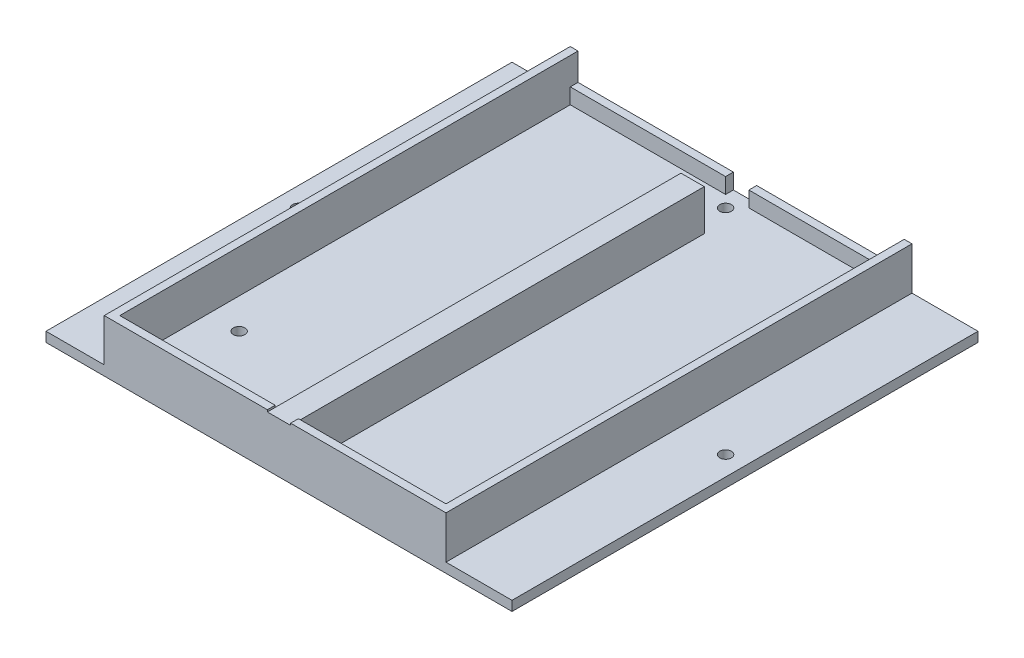
ISO-10303-21;
HEADER;
FILE_DESCRIPTION(('STEP AP214'),'2;1');
FILE_NAME('part.step','',(''),(''),'','','');
FILE_SCHEMA(('AUTOMOTIVE_DESIGN { 1 0 10303 214 1 1 1 1 }'));
ENDSEC;
DATA;
#1=APPLICATION_CONTEXT('core data for automotive mechanical design processes');
#2=APPLICATION_PROTOCOL_DEFINITION('international standard','automotive_design',2000,#1);
#3=PRODUCT_CONTEXT('',#1,'mechanical');
#4=PRODUCT('Part','Part','',(#3));
#5=PRODUCT_RELATED_PRODUCT_CATEGORY('part','',(#4));
#6=PRODUCT_DEFINITION_FORMATION('','',#4);
#7=PRODUCT_DEFINITION_CONTEXT('part definition',#1,'design');
#8=PRODUCT_DEFINITION('design','',#6,#7);
#9=PRODUCT_DEFINITION_SHAPE('','',#8);
#10=(LENGTH_UNIT() NAMED_UNIT(*) SI_UNIT(.MILLI.,.METRE.));
#11=(NAMED_UNIT(*) PLANE_ANGLE_UNIT() SI_UNIT($,.RADIAN.));
#12=(NAMED_UNIT(*) SI_UNIT($,.STERADIAN.) SOLID_ANGLE_UNIT());
#13=UNCERTAINTY_MEASURE_WITH_UNIT(LENGTH_MEASURE(1.E-05),#10,'distance_accuracy_value','');
#14=(GEOMETRIC_REPRESENTATION_CONTEXT(3) GLOBAL_UNCERTAINTY_ASSIGNED_CONTEXT((#13)) GLOBAL_UNIT_ASSIGNED_CONTEXT((#10,
#11,#12)) REPRESENTATION_CONTEXT('',''));
#15=CARTESIAN_POINT('',(0.,0.,0.));
#16=DIRECTION('',(0.,0.,1.));
#17=DIRECTION('',(1.,0.,0.));
#18=AXIS2_PLACEMENT_3D('',#15,#16,#17);
#19=CARTESIAN_POINT('',(2.99999999999999,13.,0.));
#20=DIRECTION('',(1.,0.,0.));
#21=DIRECTION('',(0.,0.,-1.));
#22=AXIS2_PLACEMENT_3D('',#19,#20,#21);
#23=PLANE('',#22);
#24=DIRECTION('',(0.,0.,1.));
#25=VECTOR('',#24,1.);
#26=CARTESIAN_POINT('',(2.99999999999999,2.5,0.));
#27=LINE('',#26,#25);
#28=CARTESIAN_POINT('',(3.00000000000001,2.5,-46.5076114932204));
#29=VERTEX_POINT('',#28);
#30=CARTESIAN_POINT('',(2.99999999999999,2.5,58.));
#31=VERTEX_POINT('',#30);
#32=EDGE_CURVE('E222',#29,#31,#27,.T.);
#33=ORIENTED_EDGE('',*,*,#32,.F.);
#34=DIRECTION('',(0.,-1.,0.));
#35=VECTOR('',#34,1.);
#36=CARTESIAN_POINT('',(3.00000000000001,13.5,-46.5076114932204));
#37=LINE('',#36,#35);
#38=CARTESIAN_POINT('',(3.00000000000001,13.,-46.5076114932204));
#39=VERTEX_POINT('',#38);
#40=EDGE_CURVE('E208',#39,#29,#37,.T.);
#41=ORIENTED_EDGE('',*,*,#40,.F.);
#42=DIRECTION('',(0.,0.,1.));
#43=VECTOR('',#42,1.);
#44=CARTESIAN_POINT('',(2.99999999999999,13.,0.));
#45=LINE('',#44,#43);
#46=CARTESIAN_POINT('',(2.99999999999999,13.,58.));
#47=VERTEX_POINT('',#46);
#48=EDGE_CURVE('E419',#39,#47,#45,.T.);
#49=ORIENTED_EDGE('',*,*,#48,.T.);
#50=DIRECTION('',(0.,-1.,0.));
#51=VECTOR('',#50,1.);
#52=CARTESIAN_POINT('',(2.99999999999999,13.5,58.));
#53=LINE('',#52,#51);
#54=EDGE_CURVE('E229',#47,#31,#53,.T.);
#55=ORIENTED_EDGE('',*,*,#54,.T.);
#56=EDGE_LOOP('',(#33,#41,#49,#55));
#57=FACE_BOUND('',#56,.T.);
#58=ADVANCED_FACE('F38',(#57),#23,.T.);
#59=CARTESIAN_POINT('',(-3.,13.,0.));
#60=DIRECTION('',(-1.,0.,0.));
#61=DIRECTION('',(0.,0.,1.));
#62=AXIS2_PLACEMENT_3D('',#59,#60,#61);
#63=PLANE('',#62);
#64=DIRECTION('',(0.,0.,-1.));
#65=VECTOR('',#64,1.);
#66=CARTESIAN_POINT('',(-3.,13.,0.));
#67=LINE('',#66,#65);
#68=CARTESIAN_POINT('',(-3.00000000000001,13.,58.));
#69=VERTEX_POINT('',#68);
#70=CARTESIAN_POINT('',(-3.,13.,-46.5076114932204));
#71=VERTEX_POINT('',#70);
#72=EDGE_CURVE('E231',#69,#71,#67,.T.);
#73=ORIENTED_EDGE('',*,*,#72,.T.);
#74=DIRECTION('',(0.,-1.,0.));
#75=VECTOR('',#74,1.);
#76=CARTESIAN_POINT('',(-3.,13.5,-46.5076114932204));
#77=LINE('',#76,#75);
#78=CARTESIAN_POINT('',(-3.,2.5,-46.5076114932204));
#79=VERTEX_POINT('',#78);
#80=EDGE_CURVE('E216',#71,#79,#77,.T.);
#81=ORIENTED_EDGE('',*,*,#80,.T.);
#82=DIRECTION('',(0.,0.,-1.));
#83=VECTOR('',#82,1.);
#84=CARTESIAN_POINT('',(-3.,2.5,0.));
#85=LINE('',#84,#83);
#86=CARTESIAN_POINT('',(-3.00000000000001,2.5,58.));
#87=VERTEX_POINT('',#86);
#88=EDGE_CURVE('E225',#87,#79,#85,.T.);
#89=ORIENTED_EDGE('',*,*,#88,.F.);
#90=DIRECTION('',(0.,-1.,0.));
#91=VECTOR('',#90,1.);
#92=CARTESIAN_POINT('',(-3.00000000000001,13.5,58.));
#93=LINE('',#92,#91);
#94=EDGE_CURVE('E413',#69,#87,#93,.T.);
#95=ORIENTED_EDGE('',*,*,#94,.F.);
#96=EDGE_LOOP('',(#73,#81,#89,#95));
#97=FACE_BOUND('',#96,.T.);
#98=ADVANCED_FACE('F480',(#97),#63,.T.);
#99=CARTESIAN_POINT('',(0.,13.,0.));
#100=DIRECTION('',(0.,1.,0.));
#101=DIRECTION('',(0.,0.,1.));
#102=AXIS2_PLACEMENT_3D('',#99,#100,#101);
#103=PLANE('',#102);
#104=ORIENTED_EDGE('',*,*,#48,.F.);
#105=DIRECTION('',(-1.,0.,0.));
#106=VECTOR('',#105,1.);
#107=CARTESIAN_POINT('',(0.,13.,-46.5076114932204));
#108=LINE('',#107,#106);
#109=EDGE_CURVE('E11',#39,#71,#108,.T.);
#110=ORIENTED_EDGE('',*,*,#109,.T.);
#111=ORIENTED_EDGE('',*,*,#72,.F.);
#112=CARTESIAN_POINT('',(-3.00000000000001,13.,60.));
#113=VERTEX_POINT('',#112);
#114=EDGE_CURVE('E234',#113,#69,#67,.T.);
#115=ORIENTED_EDGE('',*,*,#114,.F.);
#116=DIRECTION('',(1.,0.,0.));
#117=VECTOR('',#116,1.);
#118=CARTESIAN_POINT('',(0.,13.,60.));
#119=LINE('',#118,#117);
#120=CARTESIAN_POINT('',(2.99999999999999,13.,60.));
#121=VERTEX_POINT('',#120);
#122=EDGE_CURVE('E417',#113,#121,#119,.T.);
#123=ORIENTED_EDGE('',*,*,#122,.T.);
#124=EDGE_CURVE('E418',#47,#121,#45,.T.);
#125=ORIENTED_EDGE('',*,*,#124,.F.);
#126=EDGE_LOOP('',(#104,#110,#111,#115,#123,#125));
#127=FACE_BOUND('',#126,.T.);
#128=ADVANCED_FACE('F484',(#127),#103,.T.);
#129=CARTESIAN_POINT('',(0.,0.,-60.));
#130=DIRECTION('',(0.,0.,-1.));
#131=DIRECTION('',(-1.,0.,0.));
#132=AXIS2_PLACEMENT_3D('',#129,#130,#131);
#133=PLANE('',#132);
#134=DIRECTION('',(-1.,0.,0.));
#135=VECTOR('',#134,1.);
#136=CARTESIAN_POINT('',(41.,6.5,-60.));
#137=LINE('',#136,#135);
#138=CARTESIAN_POINT('',(-2.99999999999999,6.5,-60.));
#139=VERTEX_POINT('',#138);
#140=CARTESIAN_POINT('',(-43.,6.5,-60.));
#141=VERTEX_POINT('',#140);
#142=EDGE_CURVE('E55',#139,#141,#137,.T.);
#143=ORIENTED_EDGE('',*,*,#142,.F.);
#144=DIRECTION('',(0.,-1.,0.));
#145=VECTOR('',#144,1.);
#146=CARTESIAN_POINT('',(-3.,30.5,-60.));
#147=LINE('',#146,#145);
#148=CARTESIAN_POINT('',(-3.,2.5,-60.));
#149=VERTEX_POINT('',#148);
#150=EDGE_CURVE('E308',#139,#149,#147,.T.);
#151=ORIENTED_EDGE('',*,*,#150,.T.);
#152=DIRECTION('',(-1.,0.,0.));
#153=VECTOR('',#152,1.);
#154=CARTESIAN_POINT('',(0.,2.5,-60.));
#155=LINE('',#154,#153);
#156=CARTESIAN_POINT('',(3.00000000000002,2.5,-60.));
#157=VERTEX_POINT('',#156);
#158=EDGE_CURVE('E297',#157,#149,#155,.T.);
#159=ORIENTED_EDGE('',*,*,#158,.F.);
#160=DIRECTION('',(0.,-1.,0.));
#161=VECTOR('',#160,1.);
#162=CARTESIAN_POINT('',(3.00000000000002,30.5,-60.));
#163=LINE('',#162,#161);
#164=CARTESIAN_POINT('',(3.00000000000002,6.5,-60.));
#165=VERTEX_POINT('',#164);
#166=EDGE_CURVE('E306',#165,#157,#163,.T.);
#167=ORIENTED_EDGE('',*,*,#166,.F.);
#168=CARTESIAN_POINT('',(41.,6.5,-60.));
#169=VERTEX_POINT('',#168);
#170=EDGE_CURVE('E312',#169,#165,#137,.T.);
#171=ORIENTED_EDGE('',*,*,#170,.F.);
#172=DIRECTION('',(0.,-1.,0.));
#173=VECTOR('',#172,1.);
#174=CARTESIAN_POINT('',(41.,13.5,-60.));
#175=LINE('',#174,#173);
#176=CARTESIAN_POINT('',(41.,13.5,-60.));
#177=VERTEX_POINT('',#176);
#178=EDGE_CURVE('E364',#177,#169,#175,.T.);
#179=ORIENTED_EDGE('',*,*,#178,.F.);
#180=DIRECTION('',(-1.,0.,0.));
#181=VECTOR('',#180,1.);
#182=CARTESIAN_POINT('',(43.,13.5,-60.));
#183=LINE('',#182,#181);
#184=CARTESIAN_POINT('',(43.,13.5,-60.));
#185=VERTEX_POINT('',#184);
#186=EDGE_CURVE('E347',#185,#177,#183,.T.);
#187=ORIENTED_EDGE('',*,*,#186,.F.);
#188=DIRECTION('',(0.,-1.,0.));
#189=VECTOR('',#188,1.);
#190=CARTESIAN_POINT('',(43.,13.5,-60.));
#191=LINE('',#190,#189);
#192=CARTESIAN_POINT('',(43.,2.5,-60.));
#193=VERTEX_POINT('',#192);
#194=EDGE_CURVE('E367',#185,#193,#191,.T.);
#195=ORIENTED_EDGE('',*,*,#194,.T.);
#196=DIRECTION('',(-1.,0.,0.));
#197=VECTOR('',#196,1.);
#198=CARTESIAN_POINT('',(0.,2.5,-60.));
#199=LINE('',#198,#197);
#200=CARTESIAN_POINT('',(60.,2.5,-60.));
#201=VERTEX_POINT('',#200);
#202=EDGE_CURVE('E250',#201,#193,#199,.T.);
#203=ORIENTED_EDGE('',*,*,#202,.F.);
#204=DIRECTION('',(0.,1.,0.));
#205=VECTOR('',#204,1.);
#206=CARTESIAN_POINT('',(60.,0.,-60.));
#207=LINE('',#206,#205);
#208=CARTESIAN_POINT('',(60.,0.,-60.));
#209=VERTEX_POINT('',#208);
#210=EDGE_CURVE('E47',#209,#201,#207,.T.);
#211=ORIENTED_EDGE('',*,*,#210,.F.);
#212=DIRECTION('',(-1.,0.,0.));
#213=VECTOR('',#212,1.);
#214=CARTESIAN_POINT('',(60.,0.,-60.));
#215=LINE('',#214,#213);
#216=CARTESIAN_POINT('',(-60.,0.,-60.));
#217=VERTEX_POINT('',#216);
#218=EDGE_CURVE('E240',#209,#217,#215,.T.);
#219=ORIENTED_EDGE('',*,*,#218,.T.);
#220=DIRECTION('',(0.,1.,0.));
#221=VECTOR('',#220,1.);
#222=CARTESIAN_POINT('',(-60.,0.,-60.));
#223=LINE('',#222,#221);
#224=CARTESIAN_POINT('',(-60.,2.5,-60.));
#225=VERTEX_POINT('',#224);
#226=EDGE_CURVE('E249',#217,#225,#223,.T.);
#227=ORIENTED_EDGE('',*,*,#226,.T.);
#228=CARTESIAN_POINT('',(-45.,2.5,-60.));
#229=VERTEX_POINT('',#228);
#230=EDGE_CURVE('E253',#229,#225,#199,.T.);
#231=ORIENTED_EDGE('',*,*,#230,.F.);
#232=DIRECTION('',(0.,-1.,0.));
#233=VECTOR('',#232,1.);
#234=CARTESIAN_POINT('',(-45.,13.5,-60.));
#235=LINE('',#234,#233);
#236=CARTESIAN_POINT('',(-45.,13.5,-60.));
#237=VERTEX_POINT('',#236);
#238=EDGE_CURVE('E404',#237,#229,#235,.T.);
#239=ORIENTED_EDGE('',*,*,#238,.F.);
#240=DIRECTION('',(-1.,0.,0.));
#241=VECTOR('',#240,1.);
#242=CARTESIAN_POINT('',(0.,13.5,-60.));
#243=LINE('',#242,#241);
#244=CARTESIAN_POINT('',(-43.,13.5,-60.));
#245=VERTEX_POINT('',#244);
#246=EDGE_CURVE('E385',#245,#237,#243,.T.);
#247=ORIENTED_EDGE('',*,*,#246,.F.);
#248=DIRECTION('',(0.,-1.,0.));
#249=VECTOR('',#248,1.);
#250=CARTESIAN_POINT('',(-43.,13.5,-60.));
#251=LINE('',#250,#249);
#252=EDGE_CURVE('E407',#245,#141,#251,.T.);
#253=ORIENTED_EDGE('',*,*,#252,.T.);
#254=EDGE_LOOP('',(#143,#151,#159,#167,#171,#179,#187,#195,#203,#211,#219,#227,#231,#239,#247,#253));
#255=FACE_BOUND('',#254,.T.);
#256=ADVANCED_FACE('F454',(#255),#133,.T.);
#257=CARTESIAN_POINT('',(0.,2.5,0.));
#258=DIRECTION('',(0.,1.,0.));
#259=DIRECTION('',(0.,0.,1.));
#260=AXIS2_PLACEMENT_3D('',#257,#258,#259);
#261=PLANE('',#260);
#262=CARTESIAN_POINT('',(0.,2.5,-55.));
#263=DIRECTION('',(0.,1.,0.));
#264=DIRECTION('',(0.,0.,1.));
#265=AXIS2_PLACEMENT_3D('',#262,#263,#264);
#266=CIRCLE('',#265,1.5);
#267=CARTESIAN_POINT('',(0.,2.5,-53.5));
#268=VERTEX_POINT('',#267);
#269=EDGE_CURVE('E291',#268,#268,#266,.T.);
#270=ORIENTED_EDGE('',*,*,#269,.F.);
#271=EDGE_LOOP('',(#270));
#272=FACE_BOUND('',#271,.T.);
#273=CARTESIAN_POINT('',(-35.1290648893477,2.5,35.1290648893477));
#274=DIRECTION('',(0.,1.,0.));
#275=DIRECTION('',(0.,0.,1.));
#276=AXIS2_PLACEMENT_3D('',#273,#274,#275);
#277=CIRCLE('',#276,1.5);
#278=CARTESIAN_POINT('',(-35.1290648893477,2.5,36.6290648893477));
#279=VERTEX_POINT('',#278);
#280=EDGE_CURVE('E272',#279,#279,#277,.T.);
#281=ORIENTED_EDGE('',*,*,#280,.F.);
#282=EDGE_LOOP('',(#281));
#283=FACE_BOUND('',#282,.T.);
#284=CARTESIAN_POINT('',(35.1290648893477,2.5,35.1290648893477));
#285=DIRECTION('',(0.,1.,0.));
#286=DIRECTION('',(0.,0.,1.));
#287=AXIS2_PLACEMENT_3D('',#284,#285,#286);
#288=CIRCLE('',#287,1.5);
#289=CARTESIAN_POINT('',(35.1290648893477,2.5,36.6290648893477));
#290=VERTEX_POINT('',#289);
#291=EDGE_CURVE('E284',#290,#290,#288,.T.);
#292=ORIENTED_EDGE('',*,*,#291,.F.);
#293=EDGE_LOOP('',(#292));
#294=FACE_BOUND('',#293,.T.);
#295=DIRECTION('',(1.,0.,0.));
#296=VECTOR('',#295,1.);
#297=CARTESIAN_POINT('',(-3.,2.5,-46.5076114932204));
#298=LINE('',#297,#296);
#299=EDGE_CURVE('E211',#79,#29,#298,.T.);
#300=ORIENTED_EDGE('',*,*,#299,.T.);
#301=ORIENTED_EDGE('',*,*,#32,.T.);
#302=DIRECTION('',(-1.,0.,0.));
#303=VECTOR('',#302,1.);
#304=CARTESIAN_POINT('',(41.,2.5,58.));
#305=LINE('',#304,#303);
#306=CARTESIAN_POINT('',(41.,2.5,58.));
#307=VERTEX_POINT('',#306);
#308=EDGE_CURVE('E343',#307,#31,#305,.T.);
#309=ORIENTED_EDGE('',*,*,#308,.F.);
#310=DIRECTION('',(0.,0.,1.));
#311=VECTOR('',#310,1.);
#312=CARTESIAN_POINT('',(41.,2.5,-60.));
#313=LINE('',#312,#311);
#314=CARTESIAN_POINT('',(41.,2.5,-58.));
#315=VERTEX_POINT('',#314);
#316=EDGE_CURVE('E355',#315,#307,#313,.T.);
#317=ORIENTED_EDGE('',*,*,#316,.F.);
#318=DIRECTION('',(1.,0.,0.));
#319=VECTOR('',#318,1.);
#320=CARTESIAN_POINT('',(-43.,2.5,-58.));
#321=LINE('',#320,#319);
#322=CARTESIAN_POINT('',(3.00000000000002,2.5,-58.));
#323=VERTEX_POINT('',#322);
#324=EDGE_CURVE('E311',#323,#315,#321,.T.);
#325=ORIENTED_EDGE('',*,*,#324,.F.);
#326=DIRECTION('',(0.,0.,1.));
#327=VECTOR('',#326,1.);
#328=CARTESIAN_POINT('',(3.00000000000002,2.5,0.));
#329=LINE('',#328,#327);
#330=EDGE_CURVE('E304',#157,#323,#329,.T.);
#331=ORIENTED_EDGE('',*,*,#330,.F.);
#332=ORIENTED_EDGE('',*,*,#158,.T.);
#333=DIRECTION('',(0.,0.,1.));
#334=VECTOR('',#333,1.);
#335=CARTESIAN_POINT('',(-3.,2.5,0.));
#336=LINE('',#335,#334);
#337=CARTESIAN_POINT('',(-3.,2.5,-58.));
#338=VERTEX_POINT('',#337);
#339=EDGE_CURVE('E301',#149,#338,#336,.T.);
#340=ORIENTED_EDGE('',*,*,#339,.T.);
#341=CARTESIAN_POINT('',(-43.,2.5,-58.));
#342=VERTEX_POINT('',#341);
#343=EDGE_CURVE('E323',#342,#338,#321,.T.);
#344=ORIENTED_EDGE('',*,*,#343,.F.);
#345=DIRECTION('',(0.,0.,-1.));
#346=VECTOR('',#345,1.);
#347=CARTESIAN_POINT('',(-43.,2.5,0.));
#348=LINE('',#347,#346);
#349=CARTESIAN_POINT('',(-43.,2.5,58.));
#350=VERTEX_POINT('',#349);
#351=EDGE_CURVE('E394',#350,#342,#348,.T.);
#352=ORIENTED_EDGE('',*,*,#351,.F.);
#353=DIRECTION('',(-1.,0.,0.));
#354=VECTOR('',#353,1.);
#355=CARTESIAN_POINT('',(0.,2.5,58.));
#356=LINE('',#355,#354);
#357=EDGE_CURVE('E376',#87,#350,#356,.T.);
#358=ORIENTED_EDGE('',*,*,#357,.F.);
#359=ORIENTED_EDGE('',*,*,#88,.T.);
#360=EDGE_LOOP('',(#300,#301,#309,#317,#325,#331,#332,#340,#344,#352,#358,#359));
#361=FACE_BOUND('',#360,.T.);
#362=ADVANCED_FACE('F220',(#272,#283,#294,#361),#261,.T.);
#363=CARTESIAN_POINT('',(-43.,13.5,0.));
#364=DIRECTION('',(-1.,0.,0.));
#365=DIRECTION('',(0.,0.,1.));
#366=AXIS2_PLACEMENT_3D('',#363,#364,#365);
#367=PLANE('',#366);
#368=DIRECTION('',(0.,-1.,0.));
#369=VECTOR('',#368,1.);
#370=CARTESIAN_POINT('',(-43.,6.5,-58.));
#371=LINE('',#370,#369);
#372=CARTESIAN_POINT('',(-43.,6.5,-58.));
#373=VERTEX_POINT('',#372);
#374=EDGE_CURVE('E327',#373,#342,#371,.T.);
#375=ORIENTED_EDGE('',*,*,#374,.F.);
#376=DIRECTION('',(0.,0.,1.));
#377=VECTOR('',#376,1.);
#378=CARTESIAN_POINT('',(-43.,6.5,-60.));
#379=LINE('',#378,#377);
#380=EDGE_CURVE('E315',#141,#373,#379,.T.);
#381=ORIENTED_EDGE('',*,*,#380,.F.);
#382=ORIENTED_EDGE('',*,*,#252,.F.);
#383=DIRECTION('',(0.,0.,-1.));
#384=VECTOR('',#383,1.);
#385=CARTESIAN_POINT('',(-43.,13.5,0.));
#386=LINE('',#385,#384);
#387=CARTESIAN_POINT('',(-43.,13.5,58.));
#388=VERTEX_POINT('',#387);
#389=EDGE_CURVE('E383',#388,#245,#386,.T.);
#390=ORIENTED_EDGE('',*,*,#389,.F.);
#391=DIRECTION('',(0.,-1.,0.));
#392=VECTOR('',#391,1.);
#393=CARTESIAN_POINT('',(-43.,13.5,58.));
#394=LINE('',#393,#392);
#395=EDGE_CURVE('E410',#388,#350,#394,.T.);
#396=ORIENTED_EDGE('',*,*,#395,.T.);
#397=ORIENTED_EDGE('',*,*,#351,.T.);
#398=EDGE_LOOP('',(#375,#381,#382,#390,#396,#397));
#399=FACE_BOUND('',#398,.T.);
#400=ADVANCED_FACE('F470',(#399),#367,.F.);
#401=CARTESIAN_POINT('',(41.,13.5,-60.));
#402=DIRECTION('',(1.,0.,0.));
#403=DIRECTION('',(0.,0.,-1.));
#404=AXIS2_PLACEMENT_3D('',#401,#402,#403);
#405=PLANE('',#404);
#406=DIRECTION('',(0.,-1.,0.));
#407=VECTOR('',#406,1.);
#408=CARTESIAN_POINT('',(41.,6.5,-58.));
#409=LINE('',#408,#407);
#410=CARTESIAN_POINT('',(41.,6.5,-58.));
#411=VERTEX_POINT('',#410);
#412=EDGE_CURVE('E63',#411,#315,#409,.T.);
#413=ORIENTED_EDGE('',*,*,#412,.T.);
#414=ORIENTED_EDGE('',*,*,#316,.T.);
#415=DIRECTION('',(0.,-1.,0.));
#416=VECTOR('',#415,1.);
#417=CARTESIAN_POINT('',(41.,13.5,58.));
#418=LINE('',#417,#416);
#419=CARTESIAN_POINT('',(41.,13.5,58.));
#420=VERTEX_POINT('',#419);
#421=EDGE_CURVE('E361',#420,#307,#418,.T.);
#422=ORIENTED_EDGE('',*,*,#421,.F.);
#423=DIRECTION('',(0.,0.,1.));
#424=VECTOR('',#423,1.);
#425=CARTESIAN_POINT('',(41.,13.5,-60.));
#426=LINE('',#425,#424);
#427=EDGE_CURVE('E349',#177,#420,#426,.T.);
#428=ORIENTED_EDGE('',*,*,#427,.F.);
#429=ORIENTED_EDGE('',*,*,#178,.T.);
#430=DIRECTION('',(0.,0.,-1.));
#431=VECTOR('',#430,1.);
#432=CARTESIAN_POINT('',(41.,6.5,-58.));
#433=LINE('',#432,#431);
#434=EDGE_CURVE('E321',#411,#169,#433,.T.);
#435=ORIENTED_EDGE('',*,*,#434,.F.);
#436=EDGE_LOOP('',(#413,#414,#422,#428,#429,#435));
#437=FACE_BOUND('',#436,.T.);
#438=ADVANCED_FACE('F446',(#437),#405,.F.);
#439=CARTESIAN_POINT('',(55.,2.5,0.));
#440=DIRECTION('',(0.,1.,0.));
#441=DIRECTION('',(0.,0.,1.));
#442=AXIS2_PLACEMENT_3D('',#439,#440,#441);
#443=CIRCLE('',#442,1.5);
#444=CARTESIAN_POINT('',(55.,2.5,1.5));
#445=VERTEX_POINT('',#444);
#446=EDGE_CURVE('E280',#445,#445,#443,.T.);
#447=ORIENTED_EDGE('',*,*,#446,.F.);
#448=EDGE_LOOP('',(#447));
#449=FACE_BOUND('',#448,.T.);
#450=ORIENTED_EDGE('',*,*,#202,.T.);
#451=DIRECTION('',(0.,0.,-1.));
#452=VECTOR('',#451,1.);
#453=CARTESIAN_POINT('',(43.,2.5,60.));
#454=LINE('',#453,#452);
#455=CARTESIAN_POINT('',(43.,2.5,60.));
#456=VERTEX_POINT('',#455);
#457=EDGE_CURVE('E338',#456,#193,#454,.T.);
#458=ORIENTED_EDGE('',*,*,#457,.F.);
#459=DIRECTION('',(1.,0.,0.));
#460=VECTOR('',#459,1.);
#461=CARTESIAN_POINT('',(-60.,2.5,60.));
#462=LINE('',#461,#460);
#463=CARTESIAN_POINT('',(60.,2.5,60.));
#464=VERTEX_POINT('',#463);
#465=EDGE_CURVE('E255',#456,#464,#462,.T.);
#466=ORIENTED_EDGE('',*,*,#465,.T.);
#467=DIRECTION('',(0.,0.,-1.));
#468=VECTOR('',#467,1.);
#469=CARTESIAN_POINT('',(60.,2.5,60.));
#470=LINE('',#469,#468);
#471=EDGE_CURVE('E243',#464,#201,#470,.T.);
#472=ORIENTED_EDGE('',*,*,#471,.T.);
#473=EDGE_LOOP('',(#450,#458,#466,#472));
#474=FACE_BOUND('',#473,.T.);
#475=ADVANCED_FACE('F511',(#449,#474),#261,.T.);
#476=CARTESIAN_POINT('',(-55.,2.5,0.));
#477=DIRECTION('',(0.,1.,0.));
#478=DIRECTION('',(0.,0.,1.));
#479=AXIS2_PLACEMENT_3D('',#476,#477,#478);
#480=CIRCLE('',#479,1.5);
#481=CARTESIAN_POINT('',(-55.,2.5,1.50000000000001));
#482=VERTEX_POINT('',#481);
#483=EDGE_CURVE('E277',#482,#482,#480,.T.);
#484=ORIENTED_EDGE('',*,*,#483,.F.);
#485=EDGE_LOOP('',(#484));
#486=FACE_BOUND('',#485,.T.);
#487=CARTESIAN_POINT('',(-60.,2.5,60.));
#488=VERTEX_POINT('',#487);
#489=CARTESIAN_POINT('',(-45.,2.5,60.));
#490=VERTEX_POINT('',#489);
#491=EDGE_CURVE('E256',#488,#490,#462,.T.);
#492=ORIENTED_EDGE('',*,*,#491,.T.);
#493=DIRECTION('',(0.,0.,1.));
#494=VECTOR('',#493,1.);
#495=CARTESIAN_POINT('',(-45.,2.5,0.));
#496=LINE('',#495,#494);
#497=EDGE_CURVE('E381',#229,#490,#496,.T.);
#498=ORIENTED_EDGE('',*,*,#497,.F.);
#499=ORIENTED_EDGE('',*,*,#230,.T.);
#500=DIRECTION('',(0.,0.,1.));
#501=VECTOR('',#500,1.);
#502=CARTESIAN_POINT('',(-60.,2.5,-60.));
#503=LINE('',#502,#501);
#504=EDGE_CURVE('E252',#225,#488,#503,.T.);
#505=ORIENTED_EDGE('',*,*,#504,.T.);
#506=EDGE_LOOP('',(#492,#498,#499,#505));
#507=FACE_BOUND('',#506,.T.);
#508=ADVANCED_FACE('F502',(#486,#507),#261,.T.);
#509=CARTESIAN_POINT('',(60.,0.,60.));
#510=DIRECTION('',(1.,0.,0.));
#511=DIRECTION('',(0.,0.,-1.));
#512=AXIS2_PLACEMENT_3D('',#509,#510,#511);
#513=PLANE('',#512);
#514=DIRECTION('',(0.,0.,-1.));
#515=VECTOR('',#514,1.);
#516=CARTESIAN_POINT('',(60.,0.,60.));
#517=LINE('',#516,#515);
#518=CARTESIAN_POINT('',(60.,0.,60.));
#519=VERTEX_POINT('',#518);
#520=EDGE_CURVE('E247',#519,#209,#517,.T.);
#521=ORIENTED_EDGE('',*,*,#520,.T.);
#522=ORIENTED_EDGE('',*,*,#210,.T.);
#523=ORIENTED_EDGE('',*,*,#471,.F.);
#524=DIRECTION('',(0.,1.,0.));
#525=VECTOR('',#524,1.);
#526=CARTESIAN_POINT('',(60.,0.,60.));
#527=LINE('',#526,#525);
#528=EDGE_CURVE('E261',#519,#464,#527,.T.);
#529=ORIENTED_EDGE('',*,*,#528,.F.);
#530=EDGE_LOOP('',(#521,#522,#523,#529));
#531=FACE_BOUND('',#530,.T.);
#532=ADVANCED_FACE('F499',(#531),#513,.T.);
#533=CARTESIAN_POINT('',(-60.,0.,60.));
#534=DIRECTION('',(0.,0.,1.));
#535=DIRECTION('',(1.,0.,0.));
#536=AXIS2_PLACEMENT_3D('',#533,#534,#535);
#537=PLANE('',#536);
#538=ORIENTED_EDGE('',*,*,#465,.F.);
#539=DIRECTION('',(0.,-1.,0.));
#540=VECTOR('',#539,1.);
#541=CARTESIAN_POINT('',(43.,13.5,60.));
#542=LINE('',#541,#540);
#543=CARTESIAN_POINT('',(43.,13.5,60.));
#544=VERTEX_POINT('',#543);
#545=EDGE_CURVE('E370',#544,#456,#542,.T.);
#546=ORIENTED_EDGE('',*,*,#545,.F.);
#547=DIRECTION('',(1.,0.,0.));
#548=VECTOR('',#547,1.);
#549=CARTESIAN_POINT('',(2.99999999999999,13.5,60.));
#550=LINE('',#549,#548);
#551=CARTESIAN_POINT('',(2.99999999999999,13.5,60.));
#552=VERTEX_POINT('',#551);
#553=EDGE_CURVE('E342',#552,#544,#550,.T.);
#554=ORIENTED_EDGE('',*,*,#553,.F.);
#555=DIRECTION('',(0.,-1.,0.));
#556=VECTOR('',#555,1.);
#557=CARTESIAN_POINT('',(2.99999999999999,13.5,60.));
#558=LINE('',#557,#556);
#559=EDGE_CURVE('E373',#552,#121,#558,.T.);
#560=ORIENTED_EDGE('',*,*,#559,.T.);
#561=ORIENTED_EDGE('',*,*,#122,.F.);
#562=DIRECTION('',(0.,-1.,0.));
#563=VECTOR('',#562,1.);
#564=CARTESIAN_POINT('',(-3.00000000000001,13.5,60.));
#565=LINE('',#564,#563);
#566=CARTESIAN_POINT('',(-3.00000000000001,13.5,60.));
#567=VERTEX_POINT('',#566);
#568=EDGE_CURVE('E391',#567,#113,#565,.T.);
#569=ORIENTED_EDGE('',*,*,#568,.F.);
#570=DIRECTION('',(1.,0.,0.));
#571=VECTOR('',#570,1.);
#572=CARTESIAN_POINT('',(0.,13.5,60.));
#573=LINE('',#572,#571);
#574=CARTESIAN_POINT('',(-45.,13.5,60.));
#575=VERTEX_POINT('',#574);
#576=EDGE_CURVE('E389',#575,#567,#573,.T.);
#577=ORIENTED_EDGE('',*,*,#576,.F.);
#578=DIRECTION('',(0.,-1.,0.));
#579=VECTOR('',#578,1.);
#580=CARTESIAN_POINT('',(-45.,13.5,60.));
#581=LINE('',#580,#579);
#582=EDGE_CURVE('E401',#575,#490,#581,.T.);
#583=ORIENTED_EDGE('',*,*,#582,.T.);
#584=ORIENTED_EDGE('',*,*,#491,.F.);
#585=DIRECTION('',(0.,1.,0.));
#586=VECTOR('',#585,1.);
#587=CARTESIAN_POINT('',(-60.,0.,60.));
#588=LINE('',#587,#586);
#589=CARTESIAN_POINT('',(-60.,0.,60.));
#590=VERTEX_POINT('',#589);
#591=EDGE_CURVE('E264',#590,#488,#588,.T.);
#592=ORIENTED_EDGE('',*,*,#591,.F.);
#593=DIRECTION('',(1.,0.,0.));
#594=VECTOR('',#593,1.);
#595=CARTESIAN_POINT('',(-60.,0.,60.));
#596=LINE('',#595,#594);
#597=EDGE_CURVE('E245',#590,#519,#596,.T.);
#598=ORIENTED_EDGE('',*,*,#597,.T.);
#599=ORIENTED_EDGE('',*,*,#528,.T.);
#600=EDGE_LOOP('',(#538,#546,#554,#560,#561,#569,#577,#583,#584,#592,#598,#599));
#601=FACE_BOUND('',#600,.T.);
#602=ADVANCED_FACE('F430',(#601),#537,.T.);
#603=CARTESIAN_POINT('',(-60.,0.,-60.));
#604=DIRECTION('',(-1.,0.,0.));
#605=DIRECTION('',(0.,0.,1.));
#606=AXIS2_PLACEMENT_3D('',#603,#604,#605);
#607=PLANE('',#606);
#608=DIRECTION('',(0.,0.,1.));
#609=VECTOR('',#608,1.);
#610=CARTESIAN_POINT('',(-60.,0.,-60.));
#611=LINE('',#610,#609);
#612=EDGE_CURVE('E242',#217,#590,#611,.T.);
#613=ORIENTED_EDGE('',*,*,#612,.T.);
#614=ORIENTED_EDGE('',*,*,#591,.T.);
#615=ORIENTED_EDGE('',*,*,#504,.F.);
#616=ORIENTED_EDGE('',*,*,#226,.F.);
#617=EDGE_LOOP('',(#613,#614,#615,#616));
#618=FACE_BOUND('',#617,.T.);
#619=ADVANCED_FACE('F506',(#618),#607,.T.);
#620=CARTESIAN_POINT('',(0.,0.,0.));
#621=DIRECTION('',(0.,1.,0.));
#622=DIRECTION('',(0.,0.,1.));
#623=AXIS2_PLACEMENT_3D('',#620,#621,#622);
#624=PLANE('',#623);
#625=CARTESIAN_POINT('',(0.,0.,-55.));
#626=DIRECTION('',(0.,1.,0.));
#627=DIRECTION('',(0.,0.,1.));
#628=AXIS2_PLACEMENT_3D('',#625,#626,#627);
#629=CIRCLE('',#628,1.5);
#630=CARTESIAN_POINT('',(0.,0.,-53.5));
#631=VERTEX_POINT('',#630);
#632=EDGE_CURVE('E42',#631,#631,#629,.T.);
#633=ORIENTED_EDGE('',*,*,#632,.T.);
#634=EDGE_LOOP('',(#633));
#635=FACE_BOUND('',#634,.T.);
#636=CARTESIAN_POINT('',(55.,0.,0.));
#637=DIRECTION('',(0.,1.,0.));
#638=DIRECTION('',(0.,0.,1.));
#639=AXIS2_PLACEMENT_3D('',#636,#637,#638);
#640=CIRCLE('',#639,1.5);
#641=CARTESIAN_POINT('',(55.,0.,1.5));
#642=VERTEX_POINT('',#641);
#643=EDGE_CURVE('E278',#642,#642,#640,.T.);
#644=ORIENTED_EDGE('',*,*,#643,.T.);
#645=EDGE_LOOP('',(#644));
#646=FACE_BOUND('',#645,.T.);
#647=CARTESIAN_POINT('',(-55.,0.,0.));
#648=DIRECTION('',(0.,1.,0.));
#649=DIRECTION('',(0.,0.,1.));
#650=AXIS2_PLACEMENT_3D('',#647,#648,#649);
#651=CIRCLE('',#650,1.5);
#652=CARTESIAN_POINT('',(-55.,0.,1.50000000000001));
#653=VERTEX_POINT('',#652);
#654=EDGE_CURVE('E275',#653,#653,#651,.T.);
#655=ORIENTED_EDGE('',*,*,#654,.T.);
#656=EDGE_LOOP('',(#655));
#657=FACE_BOUND('',#656,.T.);
#658=CARTESIAN_POINT('',(-35.1290648893477,0.,35.1290648893477));
#659=DIRECTION('',(0.,1.,0.));
#660=DIRECTION('',(0.,0.,1.));
#661=AXIS2_PLACEMENT_3D('',#658,#659,#660);
#662=CIRCLE('',#661,1.5);
#663=CARTESIAN_POINT('',(-35.1290648893477,0.,36.6290648893477));
#664=VERTEX_POINT('',#663);
#665=EDGE_CURVE('E226',#664,#664,#662,.T.);
#666=ORIENTED_EDGE('',*,*,#665,.T.);
#667=EDGE_LOOP('',(#666));
#668=FACE_BOUND('',#667,.T.);
#669=CARTESIAN_POINT('',(35.1290648893477,0.,35.1290648893477));
#670=DIRECTION('',(0.,1.,0.));
#671=DIRECTION('',(0.,0.,1.));
#672=AXIS2_PLACEMENT_3D('',#669,#670,#671);
#673=CIRCLE('',#672,1.5);
#674=CARTESIAN_POINT('',(35.1290648893477,0.,36.6290648893477));
#675=VERTEX_POINT('',#674);
#676=EDGE_CURVE('E269',#675,#675,#673,.T.);
#677=ORIENTED_EDGE('',*,*,#676,.T.);
#678=EDGE_LOOP('',(#677));
#679=FACE_BOUND('',#678,.T.);
#680=ORIENTED_EDGE('',*,*,#218,.F.);
#681=ORIENTED_EDGE('',*,*,#520,.F.);
#682=ORIENTED_EDGE('',*,*,#597,.F.);
#683=ORIENTED_EDGE('',*,*,#612,.F.);
#684=EDGE_LOOP('',(#680,#681,#682,#683));
#685=FACE_BOUND('',#684,.T.);
#686=ADVANCED_FACE('F40',(#635,#646,#657,#668,#679,#685),#624,.F.);
#687=CARTESIAN_POINT('',(-3.,13.5,0.));
#688=DIRECTION('',(-1.,0.,0.));
#689=DIRECTION('',(0.,0.,1.));
#690=AXIS2_PLACEMENT_3D('',#687,#688,#689);
#691=PLANE('',#690);
#692=ORIENTED_EDGE('',*,*,#114,.T.);
#693=CARTESIAN_POINT('',(-3.00000000000001,13.5,58.));
#694=VERTEX_POINT('',#693);
#695=EDGE_CURVE('E236',#694,#69,#93,.T.);
#696=ORIENTED_EDGE('',*,*,#695,.F.);
#697=DIRECTION('',(0.,0.,-1.));
#698=VECTOR('',#697,1.);
#699=CARTESIAN_POINT('',(-3.,13.5,0.));
#700=LINE('',#699,#698);
#701=EDGE_CURVE('E377',#567,#694,#700,.T.);
#702=ORIENTED_EDGE('',*,*,#701,.F.);
#703=ORIENTED_EDGE('',*,*,#568,.T.);
#704=EDGE_LOOP('',(#692,#696,#702,#703));
#705=FACE_BOUND('',#704,.T.);
#706=ADVANCED_FACE('F482',(#705),#691,.F.);
#707=CARTESIAN_POINT('',(0.,13.5,58.));
#708=DIRECTION('',(0.,0.,1.));
#709=DIRECTION('',(1.,0.,0.));
#710=AXIS2_PLACEMENT_3D('',#707,#708,#709);
#711=PLANE('',#710);
#712=ORIENTED_EDGE('',*,*,#357,.T.);
#713=ORIENTED_EDGE('',*,*,#395,.F.);
#714=DIRECTION('',(-1.,0.,0.));
#715=VECTOR('',#714,1.);
#716=CARTESIAN_POINT('',(0.,13.5,58.));
#717=LINE('',#716,#715);
#718=EDGE_CURVE('E380',#694,#388,#717,.T.);
#719=ORIENTED_EDGE('',*,*,#718,.F.);
#720=ORIENTED_EDGE('',*,*,#695,.T.);
#721=ORIENTED_EDGE('',*,*,#94,.T.);
#722=EDGE_LOOP('',(#712,#713,#719,#720,#721));
#723=FACE_BOUND('',#722,.T.);
#724=ADVANCED_FACE('F476',(#723),#711,.F.);
#725=CARTESIAN_POINT('',(-45.,13.5,0.));
#726=DIRECTION('',(1.,0.,0.));
#727=DIRECTION('',(0.,0.,-1.));
#728=AXIS2_PLACEMENT_3D('',#725,#726,#727);
#729=PLANE('',#728);
#730=ORIENTED_EDGE('',*,*,#497,.T.);
#731=ORIENTED_EDGE('',*,*,#582,.F.);
#732=DIRECTION('',(0.,0.,1.));
#733=VECTOR('',#732,1.);
#734=CARTESIAN_POINT('',(-45.,13.5,0.));
#735=LINE('',#734,#733);
#736=EDGE_CURVE('E387',#237,#575,#735,.T.);
#737=ORIENTED_EDGE('',*,*,#736,.F.);
#738=ORIENTED_EDGE('',*,*,#238,.T.);
#739=EDGE_LOOP('',(#730,#731,#737,#738));
#740=FACE_BOUND('',#739,.T.);
#741=ADVANCED_FACE('F534',(#740),#729,.F.);
#742=CARTESIAN_POINT('',(0.,13.5,0.));
#743=DIRECTION('',(0.,1.,0.));
#744=DIRECTION('',(0.,0.,1.));
#745=AXIS2_PLACEMENT_3D('',#742,#743,#744);
#746=PLANE('',#745);
#747=ORIENTED_EDGE('',*,*,#701,.T.);
#748=ORIENTED_EDGE('',*,*,#718,.T.);
#749=ORIENTED_EDGE('',*,*,#389,.T.);
#750=ORIENTED_EDGE('',*,*,#246,.T.);
#751=ORIENTED_EDGE('',*,*,#736,.T.);
#752=ORIENTED_EDGE('',*,*,#576,.T.);
#753=EDGE_LOOP('',(#747,#748,#749,#750,#751,#752));
#754=FACE_BOUND('',#753,.T.);
#755=ADVANCED_FACE('F539',(#754),#746,.T.);
#756=CARTESIAN_POINT('',(2.99999999999999,13.5,58.));
#757=DIRECTION('',(1.,0.,0.));
#758=DIRECTION('',(0.,0.,-1.));
#759=AXIS2_PLACEMENT_3D('',#756,#757,#758);
#760=PLANE('',#759);
#761=ORIENTED_EDGE('',*,*,#124,.T.);
#762=ORIENTED_EDGE('',*,*,#559,.F.);
#763=DIRECTION('',(0.,0.,1.));
#764=VECTOR('',#763,1.);
#765=CARTESIAN_POINT('',(2.99999999999999,13.5,58.));
#766=LINE('',#765,#764);
#767=CARTESIAN_POINT('',(2.99999999999999,13.5,58.));
#768=VERTEX_POINT('',#767);
#769=EDGE_CURVE('E339',#768,#552,#766,.T.);
#770=ORIENTED_EDGE('',*,*,#769,.F.);
#771=EDGE_CURVE('E358',#768,#47,#53,.T.);
#772=ORIENTED_EDGE('',*,*,#771,.T.);
#773=EDGE_LOOP('',(#761,#762,#770,#772));
#774=FACE_BOUND('',#773,.T.);
#775=ADVANCED_FACE('F424',(#774),#760,.F.);
#776=CARTESIAN_POINT('',(43.,13.5,60.));
#777=DIRECTION('',(-1.,0.,0.));
#778=DIRECTION('',(0.,0.,1.));
#779=AXIS2_PLACEMENT_3D('',#776,#777,#778);
#780=PLANE('',#779);
#781=ORIENTED_EDGE('',*,*,#457,.T.);
#782=ORIENTED_EDGE('',*,*,#194,.F.);
#783=DIRECTION('',(0.,0.,-1.));
#784=VECTOR('',#783,1.);
#785=CARTESIAN_POINT('',(43.,13.5,60.));
#786=LINE('',#785,#784);
#787=EDGE_CURVE('E345',#544,#185,#786,.T.);
#788=ORIENTED_EDGE('',*,*,#787,.F.);
#789=ORIENTED_EDGE('',*,*,#545,.T.);
#790=EDGE_LOOP('',(#781,#782,#788,#789));
#791=FACE_BOUND('',#790,.T.);
#792=ADVANCED_FACE('F592',(#791),#780,.F.);
#793=CARTESIAN_POINT('',(41.,13.5,58.));
#794=DIRECTION('',(0.,0.,1.));
#795=DIRECTION('',(1.,0.,0.));
#796=AXIS2_PLACEMENT_3D('',#793,#794,#795);
#797=PLANE('',#796);
#798=ORIENTED_EDGE('',*,*,#308,.T.);
#799=ORIENTED_EDGE('',*,*,#54,.F.);
#800=ORIENTED_EDGE('',*,*,#771,.F.);
#801=DIRECTION('',(-1.,0.,0.));
#802=VECTOR('',#801,1.);
#803=CARTESIAN_POINT('',(41.,13.5,58.));
#804=LINE('',#803,#802);
#805=EDGE_CURVE('E351',#420,#768,#804,.T.);
#806=ORIENTED_EDGE('',*,*,#805,.F.);
#807=ORIENTED_EDGE('',*,*,#421,.T.);
#808=EDGE_LOOP('',(#798,#799,#800,#806,#807));
#809=FACE_BOUND('',#808,.T.);
#810=ADVANCED_FACE('F441',(#809),#797,.F.);
#811=CARTESIAN_POINT('',(0.,13.5,0.));
#812=DIRECTION('',(0.,1.,0.));
#813=DIRECTION('',(0.,0.,1.));
#814=AXIS2_PLACEMENT_3D('',#811,#812,#813);
#815=PLANE('',#814);
#816=ORIENTED_EDGE('',*,*,#769,.T.);
#817=ORIENTED_EDGE('',*,*,#553,.T.);
#818=ORIENTED_EDGE('',*,*,#787,.T.);
#819=ORIENTED_EDGE('',*,*,#186,.T.);
#820=ORIENTED_EDGE('',*,*,#427,.T.);
#821=ORIENTED_EDGE('',*,*,#805,.T.);
#822=EDGE_LOOP('',(#816,#817,#818,#819,#820,#821));
#823=FACE_BOUND('',#822,.T.);
#824=ADVANCED_FACE('F436',(#823),#815,.T.);
#825=CARTESIAN_POINT('',(0.,6.5,0.));
#826=DIRECTION('',(0.,1.,0.));
#827=DIRECTION('',(0.,0.,1.));
#828=AXIS2_PLACEMENT_3D('',#825,#826,#827);
#829=PLANE('',#828);
#830=ORIENTED_EDGE('',*,*,#170,.T.);
#831=DIRECTION('',(0.,0.,1.));
#832=VECTOR('',#831,1.);
#833=CARTESIAN_POINT('',(2.99999999999999,6.5,0.));
#834=LINE('',#833,#832);
#835=CARTESIAN_POINT('',(3.00000000000002,6.5,-58.));
#836=VERTEX_POINT('',#835);
#837=EDGE_CURVE('E331',#165,#836,#834,.T.);
#838=ORIENTED_EDGE('',*,*,#837,.T.);
#839=DIRECTION('',(1.,0.,0.));
#840=VECTOR('',#839,1.);
#841=CARTESIAN_POINT('',(-43.,6.5,-58.));
#842=LINE('',#841,#840);
#843=EDGE_CURVE('E317',#836,#411,#842,.T.);
#844=ORIENTED_EDGE('',*,*,#843,.T.);
#845=ORIENTED_EDGE('',*,*,#434,.T.);
#846=EDGE_LOOP('',(#830,#838,#844,#845));
#847=FACE_BOUND('',#846,.T.);
#848=ADVANCED_FACE('F451',(#847),#829,.T.);
#849=CARTESIAN_POINT('',(-43.,6.5,-58.));
#850=DIRECTION('',(0.,0.,-1.));
#851=DIRECTION('',(-1.,0.,0.));
#852=AXIS2_PLACEMENT_3D('',#849,#850,#851);
#853=PLANE('',#852);
#854=DIRECTION('',(0.,1.,0.));
#855=VECTOR('',#854,1.);
#856=CARTESIAN_POINT('',(3.,13.,-58.));
#857=LINE('',#856,#855);
#858=EDGE_CURVE('E336',#323,#836,#857,.T.);
#859=ORIENTED_EDGE('',*,*,#858,.F.);
#860=ORIENTED_EDGE('',*,*,#324,.T.);
#861=ORIENTED_EDGE('',*,*,#412,.F.);
#862=ORIENTED_EDGE('',*,*,#843,.F.);
#863=EDGE_LOOP('',(#859,#860,#861,#862));
#864=FACE_BOUND('',#863,.T.);
#865=ADVANCED_FACE('F587',(#864),#853,.F.);
#866=DIRECTION('',(0.,-1.,0.));
#867=VECTOR('',#866,1.);
#868=CARTESIAN_POINT('',(-3.,13.,-58.));
#869=LINE('',#868,#867);
#870=CARTESIAN_POINT('',(-3.,6.5,-58.));
#871=VERTEX_POINT('',#870);
#872=EDGE_CURVE('E334',#871,#338,#869,.T.);
#873=ORIENTED_EDGE('',*,*,#872,.F.);
#874=EDGE_CURVE('E318',#373,#871,#842,.T.);
#875=ORIENTED_EDGE('',*,*,#874,.F.);
#876=ORIENTED_EDGE('',*,*,#374,.T.);
#877=ORIENTED_EDGE('',*,*,#343,.T.);
#878=EDGE_LOOP('',(#873,#875,#876,#877));
#879=FACE_BOUND('',#878,.T.);
#880=ADVANCED_FACE('F468',(#879),#853,.F.);
#881=ORIENTED_EDGE('',*,*,#874,.T.);
#882=DIRECTION('',(0.,0.,-1.));
#883=VECTOR('',#882,1.);
#884=CARTESIAN_POINT('',(-3.,6.5,0.));
#885=LINE('',#884,#883);
#886=EDGE_CURVE('E329',#871,#139,#885,.T.);
#887=ORIENTED_EDGE('',*,*,#886,.T.);
#888=ORIENTED_EDGE('',*,*,#142,.T.);
#889=ORIENTED_EDGE('',*,*,#380,.T.);
#890=EDGE_LOOP('',(#881,#887,#888,#889));
#891=FACE_BOUND('',#890,.T.);
#892=ADVANCED_FACE('F464',(#891),#829,.T.);
#893=CARTESIAN_POINT('',(-3.,30.5,0.));
#894=DIRECTION('',(1.,0.,0.));
#895=DIRECTION('',(0.,0.,-1.));
#896=AXIS2_PLACEMENT_3D('',#893,#894,#895);
#897=PLANE('',#896);
#898=ORIENTED_EDGE('',*,*,#872,.T.);
#899=ORIENTED_EDGE('',*,*,#339,.F.);
#900=ORIENTED_EDGE('',*,*,#150,.F.);
#901=ORIENTED_EDGE('',*,*,#886,.F.);
#902=EDGE_LOOP('',(#898,#899,#900,#901));
#903=FACE_BOUND('',#902,.T.);
#904=ADVANCED_FACE('F462',(#903),#897,.T.);
#905=CARTESIAN_POINT('',(3.00000000000002,30.5,0.));
#906=DIRECTION('',(1.,0.,0.));
#907=DIRECTION('',(0.,0.,-1.));
#908=AXIS2_PLACEMENT_3D('',#905,#906,#907);
#909=PLANE('',#908);
#910=ORIENTED_EDGE('',*,*,#837,.F.);
#911=ORIENTED_EDGE('',*,*,#166,.T.);
#912=ORIENTED_EDGE('',*,*,#330,.T.);
#913=ORIENTED_EDGE('',*,*,#858,.T.);
#914=EDGE_LOOP('',(#910,#911,#912,#913));
#915=FACE_BOUND('',#914,.T.);
#916=ADVANCED_FACE('F458',(#915),#909,.F.);
#917=CARTESIAN_POINT('',(-3.,13.5,-46.5076114932204));
#918=DIRECTION('',(0.,0.,-1.));
#919=DIRECTION('',(-1.,0.,0.));
#920=AXIS2_PLACEMENT_3D('',#917,#918,#919);
#921=PLANE('',#920);
#922=ORIENTED_EDGE('',*,*,#40,.T.);
#923=ORIENTED_EDGE('',*,*,#299,.F.);
#924=ORIENTED_EDGE('',*,*,#80,.F.);
#925=ORIENTED_EDGE('',*,*,#109,.F.);
#926=EDGE_LOOP('',(#922,#923,#924,#925));
#927=FACE_BOUND('',#926,.T.);
#928=ADVANCED_FACE('F210',(#927),#921,.T.);
#929=CARTESIAN_POINT('',(35.1290648893477,-11.5,35.1290648893477));
#930=DIRECTION('',(0.,1.,0.));
#931=DIRECTION('',(0.,0.,1.));
#932=AXIS2_PLACEMENT_3D('',#929,#930,#931);
#933=CYLINDRICAL_SURFACE('',#932,1.5);
#934=ORIENTED_EDGE('',*,*,#291,.T.);
#935=EDGE_LOOP('',(#934));
#936=FACE_BOUND('',#935,.T.);
#937=ORIENTED_EDGE('',*,*,#676,.F.);
#938=EDGE_LOOP('',(#937));
#939=FACE_BOUND('',#938,.T.);
#940=ADVANCED_FACE('F564',(#936,#939),#933,.F.);
#941=CARTESIAN_POINT('',(-35.1290648893477,-11.5,35.1290648893477));
#942=DIRECTION('',(0.,1.,0.));
#943=DIRECTION('',(0.,0.,1.));
#944=AXIS2_PLACEMENT_3D('',#941,#942,#943);
#945=CYLINDRICAL_SURFACE('',#944,1.5);
#946=ORIENTED_EDGE('',*,*,#280,.T.);
#947=EDGE_LOOP('',(#946));
#948=FACE_BOUND('',#947,.T.);
#949=ORIENTED_EDGE('',*,*,#665,.F.);
#950=EDGE_LOOP('',(#949));
#951=FACE_BOUND('',#950,.T.);
#952=ADVANCED_FACE('F566',(#948,#951),#945,.F.);
#953=CARTESIAN_POINT('',(-55.,-0.999999999999992,0.));
#954=DIRECTION('',(0.,1.,0.));
#955=DIRECTION('',(0.,0.,1.));
#956=AXIS2_PLACEMENT_3D('',#953,#954,#955);
#957=CYLINDRICAL_SURFACE('',#956,1.5);
#958=ORIENTED_EDGE('',*,*,#483,.T.);
#959=EDGE_LOOP('',(#958));
#960=FACE_BOUND('',#959,.T.);
#961=ORIENTED_EDGE('',*,*,#654,.F.);
#962=EDGE_LOOP('',(#961));
#963=FACE_BOUND('',#962,.T.);
#964=ADVANCED_FACE('F573',(#960,#963),#957,.F.);
#965=CARTESIAN_POINT('',(55.,-0.999999999999992,0.));
#966=DIRECTION('',(0.,1.,0.));
#967=DIRECTION('',(0.,0.,1.));
#968=AXIS2_PLACEMENT_3D('',#965,#966,#967);
#969=CYLINDRICAL_SURFACE('',#968,1.5);
#970=ORIENTED_EDGE('',*,*,#446,.T.);
#971=EDGE_LOOP('',(#970));
#972=FACE_BOUND('',#971,.T.);
#973=ORIENTED_EDGE('',*,*,#643,.F.);
#974=EDGE_LOOP('',(#973));
#975=FACE_BOUND('',#974,.T.);
#976=ADVANCED_FACE('F899',(#972,#975),#969,.F.);
#977=CARTESIAN_POINT('',(0.,-11.5,-55.));
#978=DIRECTION('',(0.,1.,0.));
#979=DIRECTION('',(0.,0.,1.));
#980=AXIS2_PLACEMENT_3D('',#977,#978,#979);
#981=CYLINDRICAL_SURFACE('',#980,1.5);
#982=ORIENTED_EDGE('',*,*,#269,.T.);
#983=EDGE_LOOP('',(#982));
#984=FACE_BOUND('',#983,.T.);
#985=ORIENTED_EDGE('',*,*,#632,.F.);
#986=EDGE_LOOP('',(#985));
#987=FACE_BOUND('',#986,.T.);
#988=ADVANCED_FACE('F903',(#984,#987),#981,.F.);
#989=CLOSED_SHELL('',(#58,#98,#128,#256,#362,#400,#438,#475,#508,#532,#602,#619,#686,#706,#724,
#741,#755,#775,#792,#810,#824,#848,#865,#880,#892,#904,#916,#928,#940,#952,#964,#976,#988));
#990=MANIFOLD_SOLID_BREP('B2',#989);
#991=ADVANCED_BREP_SHAPE_REPRESENTATION('',(#18,#990),#14);
#992=SHAPE_DEFINITION_REPRESENTATION(#9,#991);
ENDSEC;
END-ISO-10303-21;
